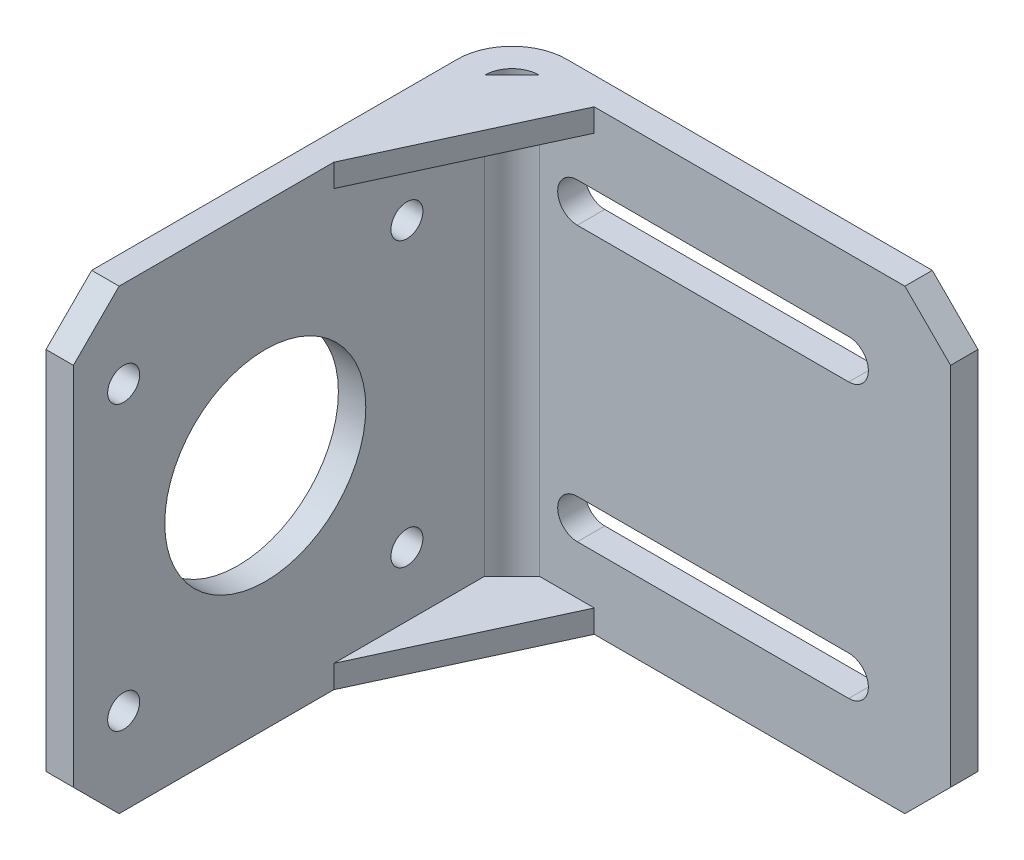
ISO-10303-21;
HEADER;
FILE_DESCRIPTION(('STEP AP214'),'2;1');
FILE_NAME('part.step','',(''),(''),'','','');
FILE_SCHEMA(('AUTOMOTIVE_DESIGN { 1 0 10303 214 1 1 1 1 }'));
ENDSEC;
DATA;
#1=APPLICATION_CONTEXT('core data for automotive mechanical design processes');
#2=APPLICATION_PROTOCOL_DEFINITION('international standard','automotive_design',2000,#1);
#3=PRODUCT_CONTEXT('',#1,'mechanical');
#4=PRODUCT('Part','Part','',(#3));
#5=PRODUCT_RELATED_PRODUCT_CATEGORY('part','',(#4));
#6=PRODUCT_DEFINITION_FORMATION('','',#4);
#7=PRODUCT_DEFINITION_CONTEXT('part definition',#1,'design');
#8=PRODUCT_DEFINITION('design','',#6,#7);
#9=PRODUCT_DEFINITION_SHAPE('','',#8);
#10=(LENGTH_UNIT() NAMED_UNIT(*) SI_UNIT(.MILLI.,.METRE.));
#11=(NAMED_UNIT(*) PLANE_ANGLE_UNIT() SI_UNIT($,.RADIAN.));
#12=(NAMED_UNIT(*) SI_UNIT($,.STERADIAN.) SOLID_ANGLE_UNIT());
#13=UNCERTAINTY_MEASURE_WITH_UNIT(LENGTH_MEASURE(1.E-05),#10,'distance_accuracy_value','');
#14=(GEOMETRIC_REPRESENTATION_CONTEXT(3) GLOBAL_UNCERTAINTY_ASSIGNED_CONTEXT((#13)) GLOBAL_UNIT_ASSIGNED_CONTEXT((#10,
#11,#12)) REPRESENTATION_CONTEXT('',''));
#15=CARTESIAN_POINT('',(0.,0.,0.));
#16=DIRECTION('',(0.,0.,1.));
#17=DIRECTION('',(1.,0.,0.));
#18=AXIS2_PLACEMENT_3D('',#15,#16,#17);
#19=CARTESIAN_POINT('',(0.,22.5,0.));
#20=DIRECTION('',(0.,1.,0.));
#21=DIRECTION('',(1.,0.,0.));
#22=AXIS2_PLACEMENT_3D('',#19,#20,#21);
#23=PLANE('',#22);
#24=DIRECTION('',(-0.419058177461747,0.,0.907959384500452));
#25=VECTOR('',#24,1.);
#26=CARTESIAN_POINT('',(12.,22.5,3.));
#27=LINE('',#26,#25);
#28=CARTESIAN_POINT('',(12.,22.5,3.));
#29=VERTEX_POINT('',#28);
#30=CARTESIAN_POINT('',(3.,22.5,22.5));
#31=VERTEX_POINT('',#30);
#32=EDGE_CURVE('E25',#29,#31,#27,.T.);
#33=ORIENTED_EDGE('',*,*,#32,.T.);
#34=DIRECTION('',(0.,0.,-1.));
#35=VECTOR('',#34,1.);
#36=CARTESIAN_POINT('',(3.,22.5,22.5));
#37=LINE('',#36,#35);
#38=CARTESIAN_POINT('',(3.,22.5,6.));
#39=VERTEX_POINT('',#38);
#40=EDGE_CURVE('E429',#31,#39,#37,.T.);
#41=ORIENTED_EDGE('',*,*,#40,.T.);
#42=DIRECTION('',(0.707106781186548,0.,-0.707106781186547));
#43=VECTOR('',#42,1.);
#44=CARTESIAN_POINT('',(3.,22.5,6.));
#45=LINE('',#44,#43);
#46=CARTESIAN_POINT('',(6.,22.5,3.));
#47=VERTEX_POINT('',#46);
#48=EDGE_CURVE('E10',#39,#47,#45,.T.);
#49=ORIENTED_EDGE('',*,*,#48,.T.);
#50=DIRECTION('',(1.,0.,0.));
#51=VECTOR('',#50,1.);
#52=CARTESIAN_POINT('',(6.,22.5,3.));
#53=LINE('',#52,#51);
#54=EDGE_CURVE('E335',#47,#29,#53,.T.);
#55=ORIENTED_EDGE('',*,*,#54,.T.);
#56=EDGE_LOOP('',(#33,#41,#49,#55));
#57=FACE_BOUND('',#56,.T.);
#58=ADVANCED_FACE('F16',(#57),#23,.F.);
#59=CARTESIAN_POINT('',(3.,22.5,6.));
#60=DIRECTION('',(0.707106781186547,0.,0.707106781186548));
#61=DIRECTION('',(0.,-1.,0.));
#62=AXIS2_PLACEMENT_3D('',#59,#60,#61);
#63=PLANE('',#62);
#64=DIRECTION('',(0.707106781186548,0.,-0.707106781186547));
#65=VECTOR('',#64,1.);
#66=CARTESIAN_POINT('',(3.,25.,6.));
#67=LINE('',#66,#65);
#68=CARTESIAN_POINT('',(3.,25.,6.));
#69=VERTEX_POINT('',#68);
#70=CARTESIAN_POINT('',(6.,25.,3.));
#71=VERTEX_POINT('',#70);
#72=EDGE_CURVE('E554',#69,#71,#67,.T.);
#73=ORIENTED_EDGE('',*,*,#72,.T.);
#74=DIRECTION('',(0.,-1.,0.));
#75=VECTOR('',#74,1.);
#76=CARTESIAN_POINT('',(6.,25.,3.));
#77=LINE('',#76,#75);
#78=EDGE_CURVE('E433',#71,#47,#77,.T.);
#79=ORIENTED_EDGE('',*,*,#78,.T.);
#80=ORIENTED_EDGE('',*,*,#48,.F.);
#81=DIRECTION('',(0.,-1.,0.));
#82=VECTOR('',#81,1.);
#83=CARTESIAN_POINT('',(3.,25.,6.));
#84=LINE('',#83,#82);
#85=EDGE_CURVE('E451',#69,#39,#84,.T.);
#86=ORIENTED_EDGE('',*,*,#85,.F.);
#87=EDGE_LOOP('',(#73,#79,#80,#86));
#88=FACE_BOUND('',#87,.T.);
#89=ADVANCED_FACE('F638',(#88),#63,.F.);
#90=CARTESIAN_POINT('',(12.,22.5,3.));
#91=DIRECTION('',(-0.907959384500452,0.,-0.419058177461747));
#92=DIRECTION('',(-0.419058177461747,0.,0.907959384500452));
#93=AXIS2_PLACEMENT_3D('',#90,#91,#92);
#94=PLANE('',#93);
#95=DIRECTION('',(-0.419058177461747,0.,0.907959384500452));
#96=VECTOR('',#95,1.);
#97=CARTESIAN_POINT('',(12.,25.,3.));
#98=LINE('',#97,#96);
#99=CARTESIAN_POINT('',(12.,25.,3.));
#100=VERTEX_POINT('',#99);
#101=CARTESIAN_POINT('',(3.,25.,22.5));
#102=VERTEX_POINT('',#101);
#103=EDGE_CURVE('E390',#100,#102,#98,.T.);
#104=ORIENTED_EDGE('',*,*,#103,.T.);
#105=DIRECTION('',(0.,1.,0.));
#106=VECTOR('',#105,1.);
#107=CARTESIAN_POINT('',(3.,22.5,22.5));
#108=LINE('',#107,#106);
#109=EDGE_CURVE('E438',#31,#102,#108,.T.);
#110=ORIENTED_EDGE('',*,*,#109,.F.);
#111=ORIENTED_EDGE('',*,*,#32,.F.);
#112=DIRECTION('',(0.,1.,0.));
#113=VECTOR('',#112,1.);
#114=CARTESIAN_POINT('',(12.,22.5,3.));
#115=LINE('',#114,#113);
#116=EDGE_CURVE('E365',#29,#100,#115,.T.);
#117=ORIENTED_EDGE('',*,*,#116,.T.);
#118=EDGE_LOOP('',(#104,#110,#111,#117));
#119=FACE_BOUND('',#118,.T.);
#120=ADVANCED_FACE('F643',(#119),#94,.F.);
#121=CARTESIAN_POINT('',(0.,-22.5,0.));
#122=DIRECTION('',(0.,-1.,0.));
#123=DIRECTION('',(0.,0.,-1.));
#124=AXIS2_PLACEMENT_3D('',#121,#122,#123);
#125=PLANE('',#124);
#126=DIRECTION('',(0.,0.,1.));
#127=VECTOR('',#126,1.);
#128=CARTESIAN_POINT('',(3.,-22.5,6.));
#129=LINE('',#128,#127);
#130=CARTESIAN_POINT('',(3.,-22.5,6.));
#131=VERTEX_POINT('',#130);
#132=CARTESIAN_POINT('',(3.,-22.5,22.5));
#133=VERTEX_POINT('',#132);
#134=EDGE_CURVE('E474',#131,#133,#129,.T.);
#135=ORIENTED_EDGE('',*,*,#134,.T.);
#136=DIRECTION('',(0.419058177461747,0.,-0.907959384500452));
#137=VECTOR('',#136,1.);
#138=CARTESIAN_POINT('',(3.,-22.5,22.5));
#139=LINE('',#138,#137);
#140=CARTESIAN_POINT('',(12.,-22.5,3.));
#141=VERTEX_POINT('',#140);
#142=EDGE_CURVE('E443',#133,#141,#139,.T.);
#143=ORIENTED_EDGE('',*,*,#142,.T.);
#144=DIRECTION('',(-1.,0.,0.));
#145=VECTOR('',#144,1.);
#146=CARTESIAN_POINT('',(12.,-22.5,3.));
#147=LINE('',#146,#145);
#148=CARTESIAN_POINT('',(6.,-22.5,3.));
#149=VERTEX_POINT('',#148);
#150=EDGE_CURVE('E334',#141,#149,#147,.T.);
#151=ORIENTED_EDGE('',*,*,#150,.T.);
#152=DIRECTION('',(-0.707106781186548,0.,0.707106781186547));
#153=VECTOR('',#152,1.);
#154=CARTESIAN_POINT('',(6.,-22.5,3.));
#155=LINE('',#154,#153);
#156=EDGE_CURVE('E19',#149,#131,#155,.T.);
#157=ORIENTED_EDGE('',*,*,#156,.T.);
#158=EDGE_LOOP('',(#135,#143,#151,#157));
#159=FACE_BOUND('',#158,.T.);
#160=ADVANCED_FACE('F713',(#159),#125,.F.);
#161=CARTESIAN_POINT('',(6.,-22.5,3.));
#162=DIRECTION('',(0.707106781186547,0.,0.707106781186548));
#163=DIRECTION('',(0.,-1.,0.));
#164=AXIS2_PLACEMENT_3D('',#161,#162,#163);
#165=PLANE('',#164);
#166=DIRECTION('',(-0.707106781186548,0.,0.707106781186547));
#167=VECTOR('',#166,1.);
#168=CARTESIAN_POINT('',(6.,-25.,3.));
#169=LINE('',#168,#167);
#170=CARTESIAN_POINT('',(6.,-25.,3.));
#171=VERTEX_POINT('',#170);
#172=CARTESIAN_POINT('',(3.,-25.,6.));
#173=VERTEX_POINT('',#172);
#174=EDGE_CURVE('E494',#171,#173,#169,.T.);
#175=ORIENTED_EDGE('',*,*,#174,.T.);
#176=DIRECTION('',(0.,-1.,0.));
#177=VECTOR('',#176,1.);
#178=CARTESIAN_POINT('',(3.,-22.5,6.));
#179=LINE('',#178,#177);
#180=EDGE_CURVE('E455',#131,#173,#179,.T.);
#181=ORIENTED_EDGE('',*,*,#180,.F.);
#182=ORIENTED_EDGE('',*,*,#156,.F.);
#183=DIRECTION('',(0.,-1.,0.));
#184=VECTOR('',#183,1.);
#185=CARTESIAN_POINT('',(6.,-22.5,3.));
#186=LINE('',#185,#184);
#187=EDGE_CURVE('E430',#149,#171,#186,.T.);
#188=ORIENTED_EDGE('',*,*,#187,.T.);
#189=EDGE_LOOP('',(#175,#181,#182,#188));
#190=FACE_BOUND('',#189,.T.);
#191=ADVANCED_FACE('F717',(#190),#165,.F.);
#192=CARTESIAN_POINT('',(3.,-22.5,22.5));
#193=DIRECTION('',(-0.907959384500452,0.,-0.419058177461747));
#194=DIRECTION('',(-0.419058177461747,0.,0.907959384500452));
#195=AXIS2_PLACEMENT_3D('',#192,#193,#194);
#196=PLANE('',#195);
#197=DIRECTION('',(0.419058177461747,0.,-0.907959384500452));
#198=VECTOR('',#197,1.);
#199=CARTESIAN_POINT('',(3.,-25.,22.5));
#200=LINE('',#199,#198);
#201=CARTESIAN_POINT('',(3.,-25.,22.5));
#202=VERTEX_POINT('',#201);
#203=CARTESIAN_POINT('',(12.,-25.,3.));
#204=VERTEX_POINT('',#203);
#205=EDGE_CURVE('E385',#202,#204,#200,.T.);
#206=ORIENTED_EDGE('',*,*,#205,.T.);
#207=DIRECTION('',(0.,-1.,0.));
#208=VECTOR('',#207,1.);
#209=CARTESIAN_POINT('',(12.,-22.5,3.));
#210=LINE('',#209,#208);
#211=EDGE_CURVE('E322',#141,#204,#210,.T.);
#212=ORIENTED_EDGE('',*,*,#211,.F.);
#213=ORIENTED_EDGE('',*,*,#142,.F.);
#214=DIRECTION('',(0.,-1.,0.));
#215=VECTOR('',#214,1.);
#216=CARTESIAN_POINT('',(3.,-22.5,22.5));
#217=LINE('',#216,#215);
#218=EDGE_CURVE('E418',#133,#202,#217,.T.);
#219=ORIENTED_EDGE('',*,*,#218,.T.);
#220=EDGE_LOOP('',(#206,#212,#213,#219));
#221=FACE_BOUND('',#220,.T.);
#222=ADVANCED_FACE('F635',(#221),#196,.F.);
#223=CARTESIAN_POINT('',(10.15,15.,-84.7610391916595));
#224=DIRECTION('',(0.,0.,1.));
#225=DIRECTION('',(1.,0.,0.));
#226=AXIS2_PLACEMENT_3D('',#223,#224,#225);
#227=CYLINDRICAL_SURFACE('',#226,2.15);
#228=DIRECTION('',(0.,0.,1.));
#229=VECTOR('',#228,1.);
#230=CARTESIAN_POINT('',(10.15,17.15,-84.7610391916595));
#231=LINE('',#230,#229);
#232=CARTESIAN_POINT('',(10.15,17.15,0.));
#233=VERTEX_POINT('',#232);
#234=CARTESIAN_POINT('',(10.15,17.15,3.));
#235=VERTEX_POINT('',#234);
#236=EDGE_CURVE('E446',#233,#235,#231,.T.);
#237=ORIENTED_EDGE('',*,*,#236,.T.);
#238=CARTESIAN_POINT('',(10.15,15.,3.));
#239=DIRECTION('',(0.,0.,-1.));
#240=DIRECTION('',(0.,-1.,0.));
#241=AXIS2_PLACEMENT_3D('',#238,#239,#240);
#242=CIRCLE('',#241,2.15);
#243=CARTESIAN_POINT('',(10.15,12.85,3.));
#244=VERTEX_POINT('',#243);
#245=EDGE_CURVE('E345',#244,#235,#242,.T.);
#246=ORIENTED_EDGE('',*,*,#245,.F.);
#247=DIRECTION('',(0.,0.,1.));
#248=VECTOR('',#247,1.);
#249=CARTESIAN_POINT('',(10.15,12.85,-84.7610391916595));
#250=LINE('',#249,#248);
#251=CARTESIAN_POINT('',(10.15,12.85,0.));
#252=VERTEX_POINT('',#251);
#253=EDGE_CURVE('E485',#252,#244,#250,.T.);
#254=ORIENTED_EDGE('',*,*,#253,.F.);
#255=CARTESIAN_POINT('',(10.15,15.,0.));
#256=DIRECTION('',(0.,0.,1.));
#257=DIRECTION('',(-1.,0.,0.));
#258=AXIS2_PLACEMENT_3D('',#255,#256,#257);
#259=CIRCLE('',#258,2.15);
#260=EDGE_CURVE('E386',#233,#252,#259,.T.);
#261=ORIENTED_EDGE('',*,*,#260,.F.);
#262=EDGE_LOOP('',(#237,#246,#254,#261));
#263=FACE_BOUND('',#262,.T.);
#264=ADVANCED_FACE('F614',(#263),#227,.F.);
#265=CARTESIAN_POINT('',(10.15,17.15,-84.7610391916595));
#266=DIRECTION('',(0.,-1.,0.));
#267=DIRECTION('',(-1.,0.,0.));
#268=AXIS2_PLACEMENT_3D('',#265,#266,#267);
#269=PLANE('',#268);
#270=DIRECTION('',(0.,0.,1.));
#271=VECTOR('',#270,1.);
#272=CARTESIAN_POINT('',(39.85,17.15,-84.7610391916595));
#273=LINE('',#272,#271);
#274=CARTESIAN_POINT('',(39.85,17.15,0.));
#275=VERTEX_POINT('',#274);
#276=CARTESIAN_POINT('',(39.85,17.15,3.));
#277=VERTEX_POINT('',#276);
#278=EDGE_CURVE('E484',#275,#277,#273,.T.);
#279=ORIENTED_EDGE('',*,*,#278,.T.);
#280=DIRECTION('',(1.,0.,0.));
#281=VECTOR('',#280,1.);
#282=CARTESIAN_POINT('',(10.15,17.15,3.));
#283=LINE('',#282,#281);
#284=EDGE_CURVE('E361',#235,#277,#283,.T.);
#285=ORIENTED_EDGE('',*,*,#284,.F.);
#286=ORIENTED_EDGE('',*,*,#236,.F.);
#287=DIRECTION('',(-1.,0.,0.));
#288=VECTOR('',#287,1.);
#289=CARTESIAN_POINT('',(0.,17.15,0.));
#290=LINE('',#289,#288);
#291=EDGE_CURVE('E391',#275,#233,#290,.T.);
#292=ORIENTED_EDGE('',*,*,#291,.F.);
#293=EDGE_LOOP('',(#279,#285,#286,#292));
#294=FACE_BOUND('',#293,.T.);
#295=ADVANCED_FACE('F626',(#294),#269,.T.);
#296=CARTESIAN_POINT('',(39.85,15.,-84.7610391916595));
#297=DIRECTION('',(0.,0.,1.));
#298=DIRECTION('',(1.,0.,0.));
#299=AXIS2_PLACEMENT_3D('',#296,#297,#298);
#300=CYLINDRICAL_SURFACE('',#299,2.15);
#301=DIRECTION('',(0.,0.,1.));
#302=VECTOR('',#301,1.);
#303=CARTESIAN_POINT('',(39.85,12.85,-84.7610391916595));
#304=LINE('',#303,#302);
#305=CARTESIAN_POINT('',(39.85,12.85,0.));
#306=VERTEX_POINT('',#305);
#307=CARTESIAN_POINT('',(39.85,12.85,3.));
#308=VERTEX_POINT('',#307);
#309=EDGE_CURVE('E481',#306,#308,#304,.T.);
#310=ORIENTED_EDGE('',*,*,#309,.T.);
#311=CARTESIAN_POINT('',(39.85,15.,3.));
#312=DIRECTION('',(0.,0.,-1.));
#313=DIRECTION('',(0.,1.,0.));
#314=AXIS2_PLACEMENT_3D('',#311,#312,#313);
#315=CIRCLE('',#314,2.15);
#316=EDGE_CURVE('E309',#277,#308,#315,.T.);
#317=ORIENTED_EDGE('',*,*,#316,.F.);
#318=ORIENTED_EDGE('',*,*,#278,.F.);
#319=CARTESIAN_POINT('',(39.85,15.,0.));
#320=DIRECTION('',(0.,0.,1.));
#321=DIRECTION('',(-1.,0.,0.));
#322=AXIS2_PLACEMENT_3D('',#319,#320,#321);
#323=CIRCLE('',#322,2.15);
#324=EDGE_CURVE('E524',#306,#275,#323,.T.);
#325=ORIENTED_EDGE('',*,*,#324,.F.);
#326=EDGE_LOOP('',(#310,#317,#318,#325));
#327=FACE_BOUND('',#326,.T.);
#328=ADVANCED_FACE('F619',(#327),#300,.F.);
#329=CARTESIAN_POINT('',(10.15,12.85,-84.7610391916595));
#330=DIRECTION('',(0.,-1.,0.));
#331=DIRECTION('',(-1.,0.,0.));
#332=AXIS2_PLACEMENT_3D('',#329,#330,#331);
#333=PLANE('',#332);
#334=DIRECTION('',(-1.,0.,0.));
#335=VECTOR('',#334,1.);
#336=CARTESIAN_POINT('',(0.,12.85,0.));
#337=LINE('',#336,#335);
#338=EDGE_CURVE('E516',#306,#252,#337,.T.);
#339=ORIENTED_EDGE('',*,*,#338,.T.);
#340=ORIENTED_EDGE('',*,*,#253,.T.);
#341=DIRECTION('',(1.,0.,0.));
#342=VECTOR('',#341,1.);
#343=CARTESIAN_POINT('',(10.15,12.85,3.));
#344=LINE('',#343,#342);
#345=EDGE_CURVE('E328',#244,#308,#344,.T.);
#346=ORIENTED_EDGE('',*,*,#345,.T.);
#347=ORIENTED_EDGE('',*,*,#309,.F.);
#348=EDGE_LOOP('',(#339,#340,#346,#347));
#349=FACE_BOUND('',#348,.T.);
#350=ADVANCED_FACE('F609',(#349),#333,.F.);
#351=CARTESIAN_POINT('',(10.15,-15.,-84.7610391916595));
#352=DIRECTION('',(0.,0.,1.));
#353=DIRECTION('',(1.,0.,0.));
#354=AXIS2_PLACEMENT_3D('',#351,#352,#353);
#355=CYLINDRICAL_SURFACE('',#354,2.15);
#356=DIRECTION('',(0.,0.,1.));
#357=VECTOR('',#356,1.);
#358=CARTESIAN_POINT('',(10.15,-12.85,-84.7610391916595));
#359=LINE('',#358,#357);
#360=CARTESIAN_POINT('',(10.15,-12.85,0.));
#361=VERTEX_POINT('',#360);
#362=CARTESIAN_POINT('',(10.15,-12.85,3.));
#363=VERTEX_POINT('',#362);
#364=EDGE_CURVE('E298',#361,#363,#359,.T.);
#365=ORIENTED_EDGE('',*,*,#364,.T.);
#366=CARTESIAN_POINT('',(10.15,-15.,3.));
#367=DIRECTION('',(0.,0.,-1.));
#368=DIRECTION('',(0.,-1.,0.));
#369=AXIS2_PLACEMENT_3D('',#366,#367,#368);
#370=CIRCLE('',#369,2.15);
#371=CARTESIAN_POINT('',(10.15,-17.15,3.));
#372=VERTEX_POINT('',#371);
#373=EDGE_CURVE('E307',#372,#363,#370,.T.);
#374=ORIENTED_EDGE('',*,*,#373,.F.);
#375=DIRECTION('',(0.,0.,1.));
#376=VECTOR('',#375,1.);
#377=CARTESIAN_POINT('',(10.15,-17.15,-84.7610391916595));
#378=LINE('',#377,#376);
#379=CARTESIAN_POINT('',(10.15,-17.15,0.));
#380=VERTEX_POINT('',#379);
#381=EDGE_CURVE('E503',#380,#372,#378,.T.);
#382=ORIENTED_EDGE('',*,*,#381,.F.);
#383=CARTESIAN_POINT('',(10.15,-15.,0.));
#384=DIRECTION('',(0.,0.,1.));
#385=DIRECTION('',(-1.,0.,0.));
#386=AXIS2_PLACEMENT_3D('',#383,#384,#385);
#387=CIRCLE('',#386,2.15);
#388=EDGE_CURVE('E463',#361,#380,#387,.T.);
#389=ORIENTED_EDGE('',*,*,#388,.F.);
#390=EDGE_LOOP('',(#365,#374,#382,#389));
#391=FACE_BOUND('',#390,.T.);
#392=ADVANCED_FACE('F1204',(#391),#355,.F.);
#393=CARTESIAN_POINT('',(10.15,-12.85,-84.7610391916595));
#394=DIRECTION('',(0.,-1.,0.));
#395=DIRECTION('',(0.,0.,-1.));
#396=AXIS2_PLACEMENT_3D('',#393,#394,#395);
#397=PLANE('',#396);
#398=DIRECTION('',(0.,0.,1.));
#399=VECTOR('',#398,1.);
#400=CARTESIAN_POINT('',(39.85,-12.85,-84.7610391916595));
#401=LINE('',#400,#399);
#402=CARTESIAN_POINT('',(39.85,-12.85,0.));
#403=VERTEX_POINT('',#402);
#404=CARTESIAN_POINT('',(39.85,-12.85,3.));
#405=VERTEX_POINT('',#404);
#406=EDGE_CURVE('E286',#403,#405,#401,.T.);
#407=ORIENTED_EDGE('',*,*,#406,.T.);
#408=DIRECTION('',(1.,0.,0.));
#409=VECTOR('',#408,1.);
#410=CARTESIAN_POINT('',(10.15,-12.85,3.));
#411=LINE('',#410,#409);
#412=EDGE_CURVE('E289',#363,#405,#411,.T.);
#413=ORIENTED_EDGE('',*,*,#412,.F.);
#414=ORIENTED_EDGE('',*,*,#364,.F.);
#415=DIRECTION('',(-1.,0.,0.));
#416=VECTOR('',#415,1.);
#417=CARTESIAN_POINT('',(0.,-12.85,0.));
#418=LINE('',#417,#416);
#419=EDGE_CURVE('E292',#403,#361,#418,.T.);
#420=ORIENTED_EDGE('',*,*,#419,.F.);
#421=EDGE_LOOP('',(#407,#413,#414,#420));
#422=FACE_BOUND('',#421,.T.);
#423=ADVANCED_FACE('F288',(#422),#397,.T.);
#424=CARTESIAN_POINT('',(39.85,-15.,-84.7610391916595));
#425=DIRECTION('',(0.,0.,1.));
#426=DIRECTION('',(1.,0.,0.));
#427=AXIS2_PLACEMENT_3D('',#424,#425,#426);
#428=CYLINDRICAL_SURFACE('',#427,2.15);
#429=DIRECTION('',(0.,0.,1.));
#430=VECTOR('',#429,1.);
#431=CARTESIAN_POINT('',(39.85,-17.15,-84.7610391916595));
#432=LINE('',#431,#430);
#433=CARTESIAN_POINT('',(39.85,-17.15,0.));
#434=VERTEX_POINT('',#433);
#435=CARTESIAN_POINT('',(39.85,-17.15,3.));
#436=VERTEX_POINT('',#435);
#437=EDGE_CURVE('E299',#434,#436,#432,.T.);
#438=ORIENTED_EDGE('',*,*,#437,.T.);
#439=CARTESIAN_POINT('',(39.85,-15.,3.));
#440=DIRECTION('',(0.,0.,-1.));
#441=DIRECTION('',(0.,1.,0.));
#442=AXIS2_PLACEMENT_3D('',#439,#440,#441);
#443=CIRCLE('',#442,2.15);
#444=EDGE_CURVE('E305',#405,#436,#443,.T.);
#445=ORIENTED_EDGE('',*,*,#444,.F.);
#446=ORIENTED_EDGE('',*,*,#406,.F.);
#447=CARTESIAN_POINT('',(39.85,-15.,0.));
#448=DIRECTION('',(0.,0.,1.));
#449=DIRECTION('',(-1.,0.,0.));
#450=AXIS2_PLACEMENT_3D('',#447,#448,#449);
#451=CIRCLE('',#450,2.15);
#452=EDGE_CURVE('E412',#434,#403,#451,.T.);
#453=ORIENTED_EDGE('',*,*,#452,.F.);
#454=EDGE_LOOP('',(#438,#445,#446,#453));
#455=FACE_BOUND('',#454,.T.);
#456=ADVANCED_FACE('F311',(#455),#428,.F.);
#457=CARTESIAN_POINT('',(10.15,-17.15,-84.7610391916595));
#458=DIRECTION('',(0.,-1.,0.));
#459=DIRECTION('',(0.,0.,-1.));
#460=AXIS2_PLACEMENT_3D('',#457,#458,#459);
#461=PLANE('',#460);
#462=DIRECTION('',(-1.,0.,0.));
#463=VECTOR('',#462,1.);
#464=CARTESIAN_POINT('',(0.,-17.15,0.));
#465=LINE('',#464,#463);
#466=EDGE_CURVE('E408',#434,#380,#465,.T.);
#467=ORIENTED_EDGE('',*,*,#466,.T.);
#468=ORIENTED_EDGE('',*,*,#381,.T.);
#469=DIRECTION('',(1.,0.,0.));
#470=VECTOR('',#469,1.);
#471=CARTESIAN_POINT('',(10.15,-17.15,3.));
#472=LINE('',#471,#470);
#473=EDGE_CURVE('E314',#372,#436,#472,.T.);
#474=ORIENTED_EDGE('',*,*,#473,.T.);
#475=ORIENTED_EDGE('',*,*,#437,.F.);
#476=EDGE_LOOP('',(#467,#468,#474,#475));
#477=FACE_BOUND('',#476,.T.);
#478=ADVANCED_FACE('F1157',(#477),#461,.F.);
#479=CARTESIAN_POINT('',(0.,20.,51.));
#480=DIRECTION('',(0.,0.707106781186548,0.707106781186547));
#481=DIRECTION('',(1.,0.,0.));
#482=AXIS2_PLACEMENT_3D('',#479,#480,#481);
#483=PLANE('',#482);
#484=DIRECTION('',(0.,-0.707106781186547,0.707106781186548));
#485=VECTOR('',#484,1.);
#486=CARTESIAN_POINT('',(3.,20.,51.));
#487=LINE('',#486,#485);
#488=CARTESIAN_POINT('',(3.,25.,46.));
#489=VERTEX_POINT('',#488);
#490=CARTESIAN_POINT('',(3.,20.,51.));
#491=VERTEX_POINT('',#490);
#492=EDGE_CURVE('E450',#489,#491,#487,.T.);
#493=ORIENTED_EDGE('',*,*,#492,.F.);
#494=DIRECTION('',(1.,0.,0.));
#495=VECTOR('',#494,1.);
#496=CARTESIAN_POINT('',(0.,25.,46.));
#497=LINE('',#496,#495);
#498=CARTESIAN_POINT('',(0.,25.,46.));
#499=VERTEX_POINT('',#498);
#500=EDGE_CURVE('E547',#499,#489,#497,.T.);
#501=ORIENTED_EDGE('',*,*,#500,.F.);
#502=DIRECTION('',(0.,0.707106781186547,-0.707106781186548));
#503=VECTOR('',#502,1.);
#504=CARTESIAN_POINT('',(0.,48.,23.));
#505=LINE('',#504,#503);
#506=CARTESIAN_POINT('',(0.,20.,51.));
#507=VERTEX_POINT('',#506);
#508=EDGE_CURVE('E528',#507,#499,#505,.T.);
#509=ORIENTED_EDGE('',*,*,#508,.F.);
#510=DIRECTION('',(-1.,0.,0.));
#511=VECTOR('',#510,1.);
#512=CARTESIAN_POINT('',(0.,20.,51.));
#513=LINE('',#512,#511);
#514=EDGE_CURVE('E346',#491,#507,#513,.T.);
#515=ORIENTED_EDGE('',*,*,#514,.F.);
#516=EDGE_LOOP('',(#493,#501,#509,#515));
#517=FACE_BOUND('',#516,.T.);
#518=ADVANCED_FACE('F695',(#517),#483,.T.);
#519=CARTESIAN_POINT('',(0.,-25.,46.));
#520=DIRECTION('',(0.,0.707106781186548,-0.707106781186548));
#521=DIRECTION('',(-1.,0.,0.));
#522=AXIS2_PLACEMENT_3D('',#519,#520,#521);
#523=PLANE('',#522);
#524=DIRECTION('',(0.,-0.707106781186548,-0.707106781186548));
#525=VECTOR('',#524,1.);
#526=CARTESIAN_POINT('',(3.,-25.,46.));
#527=LINE('',#526,#525);
#528=CARTESIAN_POINT('',(3.,-20.,51.));
#529=VERTEX_POINT('',#528);
#530=CARTESIAN_POINT('',(3.,-25.,46.));
#531=VERTEX_POINT('',#530);
#532=EDGE_CURVE('E419',#529,#531,#527,.T.);
#533=ORIENTED_EDGE('',*,*,#532,.F.);
#534=DIRECTION('',(1.,0.,0.));
#535=VECTOR('',#534,1.);
#536=CARTESIAN_POINT('',(0.,-20.,51.));
#537=LINE('',#536,#535);
#538=CARTESIAN_POINT('',(0.,-20.,51.));
#539=VERTEX_POINT('',#538);
#540=EDGE_CURVE('E351',#539,#529,#537,.T.);
#541=ORIENTED_EDGE('',*,*,#540,.F.);
#542=DIRECTION('',(0.,0.707106781186548,0.707106781186548));
#543=VECTOR('',#542,1.);
#544=CARTESIAN_POINT('',(0.,-23.,48.));
#545=LINE('',#544,#543);
#546=CARTESIAN_POINT('',(0.,-25.,46.));
#547=VERTEX_POINT('',#546);
#548=EDGE_CURVE('E531',#547,#539,#545,.T.);
#549=ORIENTED_EDGE('',*,*,#548,.F.);
#550=DIRECTION('',(-1.,0.,0.));
#551=VECTOR('',#550,1.);
#552=CARTESIAN_POINT('',(0.,-25.,46.));
#553=LINE('',#552,#551);
#554=EDGE_CURVE('E380',#531,#547,#553,.T.);
#555=ORIENTED_EDGE('',*,*,#554,.F.);
#556=EDGE_LOOP('',(#533,#541,#549,#555));
#557=FACE_BOUND('',#556,.T.);
#558=ADVANCED_FACE('F703',(#557),#523,.F.);
#559=CARTESIAN_POINT('',(51.,-20.,0.));
#560=DIRECTION('',(0.707106781186548,-0.707106781186548,0.));
#561=DIRECTION('',(0.,0.,-1.));
#562=AXIS2_PLACEMENT_3D('',#559,#560,#561);
#563=PLANE('',#562);
#564=DIRECTION('',(0.707106781186548,0.707106781186548,0.));
#565=VECTOR('',#564,1.);
#566=CARTESIAN_POINT('',(51.,-20.,3.));
#567=LINE('',#566,#565);
#568=CARTESIAN_POINT('',(46.,-25.,3.));
#569=VERTEX_POINT('',#568);
#570=CARTESIAN_POINT('',(51.,-20.,3.));
#571=VERTEX_POINT('',#570);
#572=EDGE_CURVE('E341',#569,#571,#567,.T.);
#573=ORIENTED_EDGE('',*,*,#572,.F.);
#574=DIRECTION('',(0.,0.,1.));
#575=VECTOR('',#574,1.);
#576=CARTESIAN_POINT('',(46.,-25.,0.));
#577=LINE('',#576,#575);
#578=CARTESIAN_POINT('',(46.,-25.,0.));
#579=VERTEX_POINT('',#578);
#580=EDGE_CURVE('E499',#579,#569,#577,.T.);
#581=ORIENTED_EDGE('',*,*,#580,.F.);
#582=DIRECTION('',(-0.707106781186548,-0.707106781186548,0.));
#583=VECTOR('',#582,1.);
#584=CARTESIAN_POINT('',(48.,-23.,0.));
#585=LINE('',#584,#583);
#586=CARTESIAN_POINT('',(51.,-20.,0.));
#587=VERTEX_POINT('',#586);
#588=EDGE_CURVE('E352',#587,#579,#585,.T.);
#589=ORIENTED_EDGE('',*,*,#588,.F.);
#590=DIRECTION('',(0.,0.,-1.));
#591=VECTOR('',#590,1.);
#592=CARTESIAN_POINT('',(51.,-20.,0.));
#593=LINE('',#592,#591);
#594=EDGE_CURVE('E563',#571,#587,#593,.T.);
#595=ORIENTED_EDGE('',*,*,#594,.F.);
#596=EDGE_LOOP('',(#573,#581,#589,#595));
#597=FACE_BOUND('',#596,.T.);
#598=ADVANCED_FACE('F1146',(#597),#563,.T.);
#599=CARTESIAN_POINT('',(46.,25.,0.));
#600=DIRECTION('',(-0.707106781186547,-0.707106781186548,0.));
#601=DIRECTION('',(-0.707106781186548,0.707106781186547,0.));
#602=AXIS2_PLACEMENT_3D('',#599,#600,#601);
#603=PLANE('',#602);
#604=DIRECTION('',(-0.707106781186548,0.707106781186547,0.));
#605=VECTOR('',#604,1.);
#606=CARTESIAN_POINT('',(46.,25.,3.));
#607=LINE('',#606,#605);
#608=CARTESIAN_POINT('',(51.,20.,3.));
#609=VERTEX_POINT('',#608);
#610=CARTESIAN_POINT('',(46.,25.,3.));
#611=VERTEX_POINT('',#610);
#612=EDGE_CURVE('E399',#609,#611,#607,.T.);
#613=ORIENTED_EDGE('',*,*,#612,.F.);
#614=DIRECTION('',(0.,0.,1.));
#615=VECTOR('',#614,1.);
#616=CARTESIAN_POINT('',(51.,20.,0.));
#617=LINE('',#616,#615);
#618=CARTESIAN_POINT('',(51.,20.,0.));
#619=VERTEX_POINT('',#618);
#620=EDGE_CURVE('E560',#619,#609,#617,.T.);
#621=ORIENTED_EDGE('',*,*,#620,.F.);
#622=DIRECTION('',(0.707106781186548,-0.707106781186547,0.));
#623=VECTOR('',#622,1.);
#624=CARTESIAN_POINT('',(23.,48.,0.));
#625=LINE('',#624,#623);
#626=CARTESIAN_POINT('',(46.,25.,0.));
#627=VERTEX_POINT('',#626);
#628=EDGE_CURVE('E493',#627,#619,#625,.T.);
#629=ORIENTED_EDGE('',*,*,#628,.F.);
#630=DIRECTION('',(0.,0.,-1.));
#631=VECTOR('',#630,1.);
#632=CARTESIAN_POINT('',(46.,25.,0.));
#633=LINE('',#632,#631);
#634=EDGE_CURVE('E537',#611,#627,#633,.T.);
#635=ORIENTED_EDGE('',*,*,#634,.F.);
#636=EDGE_LOOP('',(#613,#621,#629,#635));
#637=FACE_BOUND('',#636,.T.);
#638=ADVANCED_FACE('F675',(#637),#603,.F.);
#639=CARTESIAN_POINT('',(87.7610391916595,15.5,14.5));
#640=DIRECTION('',(-1.,0.,0.));
#641=DIRECTION('',(0.,0.,1.));
#642=AXIS2_PLACEMENT_3D('',#639,#640,#641);
#643=CYLINDRICAL_SURFACE('',#642,1.75);
#644=CARTESIAN_POINT('',(0.,15.5,14.5));
#645=DIRECTION('',(-1.,0.,0.));
#646=DIRECTION('',(0.,-1.,0.));
#647=AXIS2_PLACEMENT_3D('',#644,#645,#646);
#648=CIRCLE('',#647,1.75);
#649=CARTESIAN_POINT('',(0.,13.75,14.5));
#650=VERTEX_POINT('',#649);
#651=EDGE_CURVE('E350',#650,#650,#648,.T.);
#652=ORIENTED_EDGE('',*,*,#651,.T.);
#653=EDGE_LOOP('',(#652));
#654=FACE_BOUND('',#653,.T.);
#655=CARTESIAN_POINT('',(3.,15.5,14.5));
#656=DIRECTION('',(-1.,0.,0.));
#657=DIRECTION('',(0.,0.,1.));
#658=AXIS2_PLACEMENT_3D('',#655,#656,#657);
#659=CIRCLE('',#658,1.75);
#660=CARTESIAN_POINT('',(3.,15.5,16.25));
#661=VERTEX_POINT('',#660);
#662=EDGE_CURVE('E407',#661,#661,#659,.T.);
#663=ORIENTED_EDGE('',*,*,#662,.F.);
#664=EDGE_LOOP('',(#663));
#665=FACE_BOUND('',#664,.T.);
#666=ADVANCED_FACE('F1116',(#654,#665),#643,.F.);
#667=CARTESIAN_POINT('',(87.7610391916595,-15.5,14.5));
#668=DIRECTION('',(-1.,0.,0.));
#669=DIRECTION('',(0.,0.,1.));
#670=AXIS2_PLACEMENT_3D('',#667,#668,#669);
#671=CYLINDRICAL_SURFACE('',#670,1.75);
#672=CARTESIAN_POINT('',(0.,-15.5,14.5));
#673=DIRECTION('',(-1.,0.,0.));
#674=DIRECTION('',(0.,-1.,0.));
#675=AXIS2_PLACEMENT_3D('',#672,#673,#674);
#676=CIRCLE('',#675,1.75);
#677=CARTESIAN_POINT('',(0.,-17.25,14.5));
#678=VERTEX_POINT('',#677);
#679=EDGE_CURVE('E520',#678,#678,#676,.T.);
#680=ORIENTED_EDGE('',*,*,#679,.T.);
#681=EDGE_LOOP('',(#680));
#682=FACE_BOUND('',#681,.T.);
#683=CARTESIAN_POINT('',(3.,-15.5,14.5));
#684=DIRECTION('',(-1.,0.,0.));
#685=DIRECTION('',(0.,0.,1.));
#686=AXIS2_PLACEMENT_3D('',#683,#684,#685);
#687=CIRCLE('',#686,1.75);
#688=CARTESIAN_POINT('',(3.,-15.5,16.25));
#689=VERTEX_POINT('',#688);
#690=EDGE_CURVE('E422',#689,#689,#687,.T.);
#691=ORIENTED_EDGE('',*,*,#690,.F.);
#692=EDGE_LOOP('',(#691));
#693=FACE_BOUND('',#692,.T.);
#694=ADVANCED_FACE('F1111',(#682,#693),#671,.F.);
#695=CARTESIAN_POINT('',(87.7610391916595,-15.5,45.5));
#696=DIRECTION('',(-1.,0.,0.));
#697=DIRECTION('',(0.,0.,1.));
#698=AXIS2_PLACEMENT_3D('',#695,#696,#697);
#699=CYLINDRICAL_SURFACE('',#698,1.75);
#700=CARTESIAN_POINT('',(0.,-15.5,45.5));
#701=DIRECTION('',(-1.,0.,0.));
#702=DIRECTION('',(0.,-1.,0.));
#703=AXIS2_PLACEMENT_3D('',#700,#701,#702);
#704=CIRCLE('',#703,1.75);
#705=CARTESIAN_POINT('',(0.,-17.25,45.5));
#706=VERTEX_POINT('',#705);
#707=EDGE_CURVE('E517',#706,#706,#704,.T.);
#708=ORIENTED_EDGE('',*,*,#707,.T.);
#709=EDGE_LOOP('',(#708));
#710=FACE_BOUND('',#709,.T.);
#711=CARTESIAN_POINT('',(3.,-15.5,45.5));
#712=DIRECTION('',(-1.,0.,0.));
#713=DIRECTION('',(0.,0.,1.));
#714=AXIS2_PLACEMENT_3D('',#711,#712,#713);
#715=CIRCLE('',#714,1.75);
#716=CARTESIAN_POINT('',(3.,-15.5,47.25));
#717=VERTEX_POINT('',#716);
#718=EDGE_CURVE('E373',#717,#717,#715,.T.);
#719=ORIENTED_EDGE('',*,*,#718,.F.);
#720=EDGE_LOOP('',(#719));
#721=FACE_BOUND('',#720,.T.);
#722=ADVANCED_FACE('F1018',(#710,#721),#699,.F.);
#723=CARTESIAN_POINT('',(87.7610391916595,15.5,45.5));
#724=DIRECTION('',(-1.,0.,0.));
#725=DIRECTION('',(0.,0.,1.));
#726=AXIS2_PLACEMENT_3D('',#723,#724,#725);
#727=CYLINDRICAL_SURFACE('',#726,1.75);
#728=CARTESIAN_POINT('',(0.,15.5,45.5));
#729=DIRECTION('',(-1.,0.,0.));
#730=DIRECTION('',(0.,-1.,0.));
#731=AXIS2_PLACEMENT_3D('',#728,#729,#730);
#732=CIRCLE('',#731,1.75);
#733=CARTESIAN_POINT('',(0.,13.75,45.5));
#734=VERTEX_POINT('',#733);
#735=EDGE_CURVE('E43',#734,#734,#732,.T.);
#736=ORIENTED_EDGE('',*,*,#735,.T.);
#737=EDGE_LOOP('',(#736));
#738=FACE_BOUND('',#737,.T.);
#739=CARTESIAN_POINT('',(3.,15.5,45.5));
#740=DIRECTION('',(-1.,0.,0.));
#741=DIRECTION('',(0.,0.,1.));
#742=AXIS2_PLACEMENT_3D('',#739,#740,#741);
#743=CIRCLE('',#742,1.75);
#744=CARTESIAN_POINT('',(3.,15.5,47.25));
#745=VERTEX_POINT('',#744);
#746=EDGE_CURVE('E369',#745,#745,#743,.T.);
#747=ORIENTED_EDGE('',*,*,#746,.F.);
#748=EDGE_LOOP('',(#747));
#749=FACE_BOUND('',#748,.T.);
#750=ADVANCED_FACE('F1013',(#738,#749),#727,.F.);
#751=CARTESIAN_POINT('',(87.7610391916595,0.,30.));
#752=DIRECTION('',(-1.,0.,0.));
#753=DIRECTION('',(0.,0.,1.));
#754=AXIS2_PLACEMENT_3D('',#751,#752,#753);
#755=CYLINDRICAL_SURFACE('',#754,11.);
#756=CARTESIAN_POINT('',(0.,0.,30.));
#757=DIRECTION('',(-1.,0.,0.));
#758=DIRECTION('',(0.,-1.,0.));
#759=AXIS2_PLACEMENT_3D('',#756,#757,#758);
#760=CIRCLE('',#759,11.);
#761=CARTESIAN_POINT('',(0.,-11.,30.));
#762=VERTEX_POINT('',#761);
#763=EDGE_CURVE('E36',#762,#762,#760,.T.);
#764=ORIENTED_EDGE('',*,*,#763,.T.);
#765=EDGE_LOOP('',(#764));
#766=FACE_BOUND('',#765,.T.);
#767=CARTESIAN_POINT('',(3.,0.,30.));
#768=DIRECTION('',(-1.,0.,0.));
#769=DIRECTION('',(0.,0.,1.));
#770=AXIS2_PLACEMENT_3D('',#767,#768,#769);
#771=CIRCLE('',#770,11.);
#772=CARTESIAN_POINT('',(3.,0.,41.));
#773=VERTEX_POINT('',#772);
#774=EDGE_CURVE('E372',#773,#773,#771,.T.);
#775=ORIENTED_EDGE('',*,*,#774,.F.);
#776=EDGE_LOOP('',(#775));
#777=FACE_BOUND('',#776,.T.);
#778=ADVANCED_FACE('F985',(#766,#777),#755,.F.);
#779=CARTESIAN_POINT('',(6.,25.,6.));
#780=DIRECTION('',(0.,-1.,0.));
#781=DIRECTION('',(0.,0.,-1.));
#782=AXIS2_PLACEMENT_3D('',#779,#780,#781);
#783=CYLINDRICAL_SURFACE('',#782,3.);
#784=CARTESIAN_POINT('',(6.,-25.,6.));
#785=DIRECTION('',(0.,-1.,0.));
#786=DIRECTION('',(0.,0.,-1.));
#787=AXIS2_PLACEMENT_3D('',#784,#785,#786);
#788=CIRCLE('',#787,3.);
#789=EDGE_CURVE('E498',#173,#171,#788,.T.);
#790=ORIENTED_EDGE('',*,*,#789,.T.);
#791=ORIENTED_EDGE('',*,*,#187,.F.);
#792=DIRECTION('',(0.,-1.,0.));
#793=VECTOR('',#792,1.);
#794=CARTESIAN_POINT('',(6.,25.,3.));
#795=LINE('',#794,#793);
#796=EDGE_CURVE('E331',#47,#149,#795,.T.);
#797=ORIENTED_EDGE('',*,*,#796,.F.);
#798=ORIENTED_EDGE('',*,*,#78,.F.);
#799=CARTESIAN_POINT('',(6.,25.,6.));
#800=DIRECTION('',(0.,-1.,0.));
#801=DIRECTION('',(0.,0.,-1.));
#802=AXIS2_PLACEMENT_3D('',#799,#800,#801);
#803=CIRCLE('',#802,3.);
#804=EDGE_CURVE('E550',#69,#71,#803,.T.);
#805=ORIENTED_EDGE('',*,*,#804,.F.);
#806=ORIENTED_EDGE('',*,*,#85,.T.);
#807=DIRECTION('',(0.,-1.,0.));
#808=VECTOR('',#807,1.);
#809=CARTESIAN_POINT('',(3.,25.,6.));
#810=LINE('',#809,#808);
#811=EDGE_CURVE('E413',#39,#131,#810,.T.);
#812=ORIENTED_EDGE('',*,*,#811,.T.);
#813=ORIENTED_EDGE('',*,*,#180,.T.);
#814=EDGE_LOOP('',(#790,#791,#797,#798,#805,#806,#812,#813));
#815=FACE_BOUND('',#814,.T.);
#816=ADVANCED_FACE('F659',(#815),#783,.F.);
#817=CARTESIAN_POINT('',(6.,25.,6.));
#818=DIRECTION('',(0.,-1.,0.));
#819=DIRECTION('',(0.,0.,-1.));
#820=AXIS2_PLACEMENT_3D('',#817,#818,#819);
#821=CYLINDRICAL_SURFACE('',#820,6.);
#822=CARTESIAN_POINT('',(6.,-25.,6.));
#823=DIRECTION('',(0.,-1.,0.));
#824=DIRECTION('',(0.,0.,1.));
#825=AXIS2_PLACEMENT_3D('',#822,#823,#824);
#826=CIRCLE('',#825,6.);
#827=CARTESIAN_POINT('',(0.,-25.,6.));
#828=VERTEX_POINT('',#827);
#829=CARTESIAN_POINT('',(6.,-25.,0.));
#830=VERTEX_POINT('',#829);
#831=EDGE_CURVE('E573',#828,#830,#826,.T.);
#832=ORIENTED_EDGE('',*,*,#831,.F.);
#833=DIRECTION('',(0.,-1.,0.));
#834=VECTOR('',#833,1.);
#835=CARTESIAN_POINT('',(0.,25.,6.));
#836=LINE('',#835,#834);
#837=CARTESIAN_POINT('',(0.,25.,6.));
#838=VERTEX_POINT('',#837);
#839=EDGE_CURVE('E434',#838,#828,#836,.T.);
#840=ORIENTED_EDGE('',*,*,#839,.F.);
#841=CARTESIAN_POINT('',(6.,25.,6.));
#842=DIRECTION('',(0.,-1.,0.));
#843=DIRECTION('',(0.,0.,1.));
#844=AXIS2_PLACEMENT_3D('',#841,#842,#843);
#845=CIRCLE('',#844,6.);
#846=CARTESIAN_POINT('',(6.,25.,0.));
#847=VERTEX_POINT('',#846);
#848=EDGE_CURVE('E540',#838,#847,#845,.T.);
#849=ORIENTED_EDGE('',*,*,#848,.T.);
#850=DIRECTION('',(0.,-1.,0.));
#851=VECTOR('',#850,1.);
#852=CARTESIAN_POINT('',(6.,25.,0.));
#853=LINE('',#852,#851);
#854=EDGE_CURVE('E512',#847,#830,#853,.T.);
#855=ORIENTED_EDGE('',*,*,#854,.T.);
#856=EDGE_LOOP('',(#832,#840,#849,#855));
#857=FACE_BOUND('',#856,.T.);
#858=ADVANCED_FACE('F686',(#857),#821,.T.);
#859=CARTESIAN_POINT('',(0.,25.,0.));
#860=DIRECTION('',(-1.,0.,0.));
#861=DIRECTION('',(0.,0.,1.));
#862=AXIS2_PLACEMENT_3D('',#859,#860,#861);
#863=PLANE('',#862);
#864=DIRECTION('',(0.,0.,-1.));
#865=VECTOR('',#864,1.);
#866=CARTESIAN_POINT('',(0.,-25.,0.));
#867=LINE('',#866,#865);
#868=EDGE_CURVE('E384',#547,#828,#867,.T.);
#869=ORIENTED_EDGE('',*,*,#868,.F.);
#870=ORIENTED_EDGE('',*,*,#548,.T.);
#871=DIRECTION('',(0.,-1.,0.));
#872=VECTOR('',#871,1.);
#873=CARTESIAN_POINT('',(0.,25.,51.));
#874=LINE('',#873,#872);
#875=EDGE_CURVE('E581',#507,#539,#874,.T.);
#876=ORIENTED_EDGE('',*,*,#875,.F.);
#877=ORIENTED_EDGE('',*,*,#508,.T.);
#878=DIRECTION('',(0.,0.,-1.));
#879=VECTOR('',#878,1.);
#880=CARTESIAN_POINT('',(0.,25.,0.));
#881=LINE('',#880,#879);
#882=EDGE_CURVE('E543',#499,#838,#881,.T.);
#883=ORIENTED_EDGE('',*,*,#882,.T.);
#884=ORIENTED_EDGE('',*,*,#839,.T.);
#885=EDGE_LOOP('',(#869,#870,#876,#877,#883,#884));
#886=FACE_BOUND('',#885,.T.);
#887=ORIENTED_EDGE('',*,*,#763,.F.);
#888=EDGE_LOOP('',(#887));
#889=FACE_BOUND('',#888,.T.);
#890=ORIENTED_EDGE('',*,*,#735,.F.);
#891=EDGE_LOOP('',(#890));
#892=FACE_BOUND('',#891,.T.);
#893=ORIENTED_EDGE('',*,*,#707,.F.);
#894=EDGE_LOOP('',(#893));
#895=FACE_BOUND('',#894,.T.);
#896=ORIENTED_EDGE('',*,*,#679,.F.);
#897=EDGE_LOOP('',(#896));
#898=FACE_BOUND('',#897,.T.);
#899=ORIENTED_EDGE('',*,*,#651,.F.);
#900=EDGE_LOOP('',(#899));
#901=FACE_BOUND('',#900,.T.);
#902=ADVANCED_FACE('F689',(#886,#889,#892,#895,#898,#901),#863,.T.);
#903=CARTESIAN_POINT('',(0.,25.,51.));
#904=DIRECTION('',(0.,0.,-1.));
#905=DIRECTION('',(0.,-1.,0.));
#906=AXIS2_PLACEMENT_3D('',#903,#904,#905);
#907=PLANE('',#906);
#908=ORIENTED_EDGE('',*,*,#875,.T.);
#909=ORIENTED_EDGE('',*,*,#540,.T.);
#910=DIRECTION('',(0.,-1.,0.));
#911=VECTOR('',#910,1.);
#912=CARTESIAN_POINT('',(3.,25.,51.));
#913=LINE('',#912,#911);
#914=EDGE_CURVE('E458',#491,#529,#913,.T.);
#915=ORIENTED_EDGE('',*,*,#914,.F.);
#916=ORIENTED_EDGE('',*,*,#514,.T.);
#917=EDGE_LOOP('',(#908,#909,#915,#916));
#918=FACE_BOUND('',#917,.T.);
#919=ADVANCED_FACE('F700',(#918),#907,.F.);
#920=CARTESIAN_POINT('',(0.,-25.,0.));
#921=DIRECTION('',(0.,1.,0.));
#922=DIRECTION('',(1.,0.,0.));
#923=AXIS2_PLACEMENT_3D('',#920,#921,#922);
#924=PLANE('',#923);
#925=ORIENTED_EDGE('',*,*,#174,.F.);
#926=ORIENTED_EDGE('',*,*,#789,.F.);
#927=EDGE_LOOP('',(#925,#926));
#928=FACE_BOUND('',#927,.T.);
#929=DIRECTION('',(1.,0.,0.));
#930=VECTOR('',#929,1.);
#931=CARTESIAN_POINT('',(0.,-25.,3.));
#932=LINE('',#931,#930);
#933=EDGE_CURVE('E337',#204,#569,#932,.T.);
#934=ORIENTED_EDGE('',*,*,#933,.F.);
#935=ORIENTED_EDGE('',*,*,#205,.F.);
#936=DIRECTION('',(0.,0.,-1.));
#937=VECTOR('',#936,1.);
#938=CARTESIAN_POINT('',(3.,-25.,0.));
#939=LINE('',#938,#937);
#940=EDGE_CURVE('E414',#531,#202,#939,.T.);
#941=ORIENTED_EDGE('',*,*,#940,.F.);
#942=ORIENTED_EDGE('',*,*,#554,.T.);
#943=ORIENTED_EDGE('',*,*,#868,.T.);
#944=ORIENTED_EDGE('',*,*,#831,.T.);
#945=DIRECTION('',(1.,0.,0.));
#946=VECTOR('',#945,1.);
#947=CARTESIAN_POINT('',(0.,-25.,0.));
#948=LINE('',#947,#946);
#949=EDGE_CURVE('E356',#830,#579,#948,.T.);
#950=ORIENTED_EDGE('',*,*,#949,.T.);
#951=ORIENTED_EDGE('',*,*,#580,.T.);
#952=EDGE_LOOP('',(#934,#935,#941,#942,#943,#944,#950,#951));
#953=FACE_BOUND('',#952,.T.);
#954=ADVANCED_FACE('F707',(#928,#953),#924,.F.);
#955=CARTESIAN_POINT('',(51.,25.,0.));
#956=DIRECTION('',(1.,0.,0.));
#957=DIRECTION('',(0.,1.,0.));
#958=AXIS2_PLACEMENT_3D('',#955,#956,#957);
#959=PLANE('',#958);
#960=DIRECTION('',(0.,-1.,0.));
#961=VECTOR('',#960,1.);
#962=CARTESIAN_POINT('',(51.,25.,0.));
#963=LINE('',#962,#961);
#964=EDGE_CURVE('E357',#619,#587,#963,.T.);
#965=ORIENTED_EDGE('',*,*,#964,.F.);
#966=ORIENTED_EDGE('',*,*,#620,.T.);
#967=DIRECTION('',(0.,-1.,0.));
#968=VECTOR('',#967,1.);
#969=CARTESIAN_POINT('',(51.,25.,3.));
#970=LINE('',#969,#968);
#971=EDGE_CURVE('E395',#609,#571,#970,.T.);
#972=ORIENTED_EDGE('',*,*,#971,.T.);
#973=ORIENTED_EDGE('',*,*,#594,.T.);
#974=EDGE_LOOP('',(#965,#966,#972,#973));
#975=FACE_BOUND('',#974,.T.);
#976=ADVANCED_FACE('F668',(#975),#959,.T.);
#977=CARTESIAN_POINT('',(0.,25.,0.));
#978=DIRECTION('',(0.,1.,0.));
#979=DIRECTION('',(1.,0.,0.));
#980=AXIS2_PLACEMENT_3D('',#977,#978,#979);
#981=PLANE('',#980);
#982=ORIENTED_EDGE('',*,*,#804,.T.);
#983=ORIENTED_EDGE('',*,*,#72,.F.);
#984=EDGE_LOOP('',(#982,#983));
#985=FACE_BOUND('',#984,.T.);
#986=ORIENTED_EDGE('',*,*,#103,.F.);
#987=DIRECTION('',(1.,0.,0.));
#988=VECTOR('',#987,1.);
#989=CARTESIAN_POINT('',(0.,25.,3.));
#990=LINE('',#989,#988);
#991=EDGE_CURVE('E403',#100,#611,#990,.T.);
#992=ORIENTED_EDGE('',*,*,#991,.T.);
#993=ORIENTED_EDGE('',*,*,#634,.T.);
#994=DIRECTION('',(1.,0.,0.));
#995=VECTOR('',#994,1.);
#996=CARTESIAN_POINT('',(0.,25.,0.));
#997=LINE('',#996,#995);
#998=EDGE_CURVE('E467',#847,#627,#997,.T.);
#999=ORIENTED_EDGE('',*,*,#998,.F.);
#1000=ORIENTED_EDGE('',*,*,#848,.F.);
#1001=ORIENTED_EDGE('',*,*,#882,.F.);
#1002=ORIENTED_EDGE('',*,*,#500,.T.);
#1003=DIRECTION('',(0.,0.,-1.));
#1004=VECTOR('',#1003,1.);
#1005=CARTESIAN_POINT('',(3.,25.,0.));
#1006=LINE('',#1005,#1004);
#1007=EDGE_CURVE('E442',#489,#102,#1006,.T.);
#1008=ORIENTED_EDGE('',*,*,#1007,.T.);
#1009=EDGE_LOOP('',(#986,#992,#993,#999,#1000,#1001,#1002,#1008));
#1010=FACE_BOUND('',#1009,.T.);
#1011=ADVANCED_FACE('F665',(#985,#1010),#981,.T.);
#1012=CARTESIAN_POINT('',(0.,25.,0.));
#1013=DIRECTION('',(0.,0.,-1.));
#1014=DIRECTION('',(0.,-1.,0.));
#1015=AXIS2_PLACEMENT_3D('',#1012,#1013,#1014);
#1016=PLANE('',#1015);
#1017=ORIENTED_EDGE('',*,*,#338,.F.);
#1018=ORIENTED_EDGE('',*,*,#324,.T.);
#1019=ORIENTED_EDGE('',*,*,#291,.T.);
#1020=ORIENTED_EDGE('',*,*,#260,.T.);
#1021=EDGE_LOOP('',(#1017,#1018,#1019,#1020));
#1022=FACE_BOUND('',#1021,.T.);
#1023=ORIENTED_EDGE('',*,*,#998,.T.);
#1024=ORIENTED_EDGE('',*,*,#628,.T.);
#1025=ORIENTED_EDGE('',*,*,#964,.T.);
#1026=ORIENTED_EDGE('',*,*,#588,.T.);
#1027=ORIENTED_EDGE('',*,*,#949,.F.);
#1028=ORIENTED_EDGE('',*,*,#854,.F.);
#1029=EDGE_LOOP('',(#1023,#1024,#1025,#1026,#1027,#1028));
#1030=FACE_BOUND('',#1029,.T.);
#1031=ORIENTED_EDGE('',*,*,#466,.F.);
#1032=ORIENTED_EDGE('',*,*,#452,.T.);
#1033=ORIENTED_EDGE('',*,*,#419,.T.);
#1034=ORIENTED_EDGE('',*,*,#388,.T.);
#1035=EDGE_LOOP('',(#1031,#1032,#1033,#1034));
#1036=FACE_BOUND('',#1035,.T.);
#1037=ADVANCED_FACE('F623',(#1022,#1030,#1036),#1016,.T.);
#1038=CARTESIAN_POINT('',(3.,25.,0.));
#1039=DIRECTION('',(-1.,0.,0.));
#1040=DIRECTION('',(0.,0.,1.));
#1041=AXIS2_PLACEMENT_3D('',#1038,#1039,#1040);
#1042=PLANE('',#1041);
#1043=ORIENTED_EDGE('',*,*,#40,.F.);
#1044=ORIENTED_EDGE('',*,*,#109,.T.);
#1045=ORIENTED_EDGE('',*,*,#1007,.F.);
#1046=ORIENTED_EDGE('',*,*,#492,.T.);
#1047=ORIENTED_EDGE('',*,*,#914,.T.);
#1048=ORIENTED_EDGE('',*,*,#532,.T.);
#1049=ORIENTED_EDGE('',*,*,#940,.T.);
#1050=ORIENTED_EDGE('',*,*,#218,.F.);
#1051=ORIENTED_EDGE('',*,*,#134,.F.);
#1052=ORIENTED_EDGE('',*,*,#811,.F.);
#1053=EDGE_LOOP('',(#1043,#1044,#1045,#1046,#1047,#1048,#1049,#1050,#1051,#1052));
#1054=FACE_BOUND('',#1053,.T.);
#1055=ORIENTED_EDGE('',*,*,#774,.T.);
#1056=EDGE_LOOP('',(#1055));
#1057=FACE_BOUND('',#1056,.T.);
#1058=ORIENTED_EDGE('',*,*,#746,.T.);
#1059=EDGE_LOOP('',(#1058));
#1060=FACE_BOUND('',#1059,.T.);
#1061=ORIENTED_EDGE('',*,*,#718,.T.);
#1062=EDGE_LOOP('',(#1061));
#1063=FACE_BOUND('',#1062,.T.);
#1064=ORIENTED_EDGE('',*,*,#690,.T.);
#1065=EDGE_LOOP('',(#1064));
#1066=FACE_BOUND('',#1065,.T.);
#1067=ORIENTED_EDGE('',*,*,#662,.T.);
#1068=EDGE_LOOP('',(#1067));
#1069=FACE_BOUND('',#1068,.T.);
#1070=ADVANCED_FACE('F654',(#1054,#1057,#1060,#1063,#1066,#1069),#1042,.F.);
#1071=CARTESIAN_POINT('',(0.,25.,3.));
#1072=DIRECTION('',(0.,0.,-1.));
#1073=DIRECTION('',(0.,-1.,0.));
#1074=AXIS2_PLACEMENT_3D('',#1071,#1072,#1073);
#1075=PLANE('',#1074);
#1076=ORIENTED_EDGE('',*,*,#116,.F.);
#1077=ORIENTED_EDGE('',*,*,#54,.F.);
#1078=ORIENTED_EDGE('',*,*,#796,.T.);
#1079=ORIENTED_EDGE('',*,*,#150,.F.);
#1080=ORIENTED_EDGE('',*,*,#211,.T.);
#1081=ORIENTED_EDGE('',*,*,#933,.T.);
#1082=ORIENTED_EDGE('',*,*,#572,.T.);
#1083=ORIENTED_EDGE('',*,*,#971,.F.);
#1084=ORIENTED_EDGE('',*,*,#612,.T.);
#1085=ORIENTED_EDGE('',*,*,#991,.F.);
#1086=EDGE_LOOP('',(#1076,#1077,#1078,#1079,#1080,#1081,#1082,#1083,#1084,#1085));
#1087=FACE_BOUND('',#1086,.T.);
#1088=ORIENTED_EDGE('',*,*,#316,.T.);
#1089=ORIENTED_EDGE('',*,*,#345,.F.);
#1090=ORIENTED_EDGE('',*,*,#245,.T.);
#1091=ORIENTED_EDGE('',*,*,#284,.T.);
#1092=EDGE_LOOP('',(#1088,#1089,#1090,#1091));
#1093=FACE_BOUND('',#1092,.T.);
#1094=ORIENTED_EDGE('',*,*,#444,.T.);
#1095=ORIENTED_EDGE('',*,*,#473,.F.);
#1096=ORIENTED_EDGE('',*,*,#373,.T.);
#1097=ORIENTED_EDGE('',*,*,#412,.T.);
#1098=EDGE_LOOP('',(#1094,#1095,#1096,#1097));
#1099=FACE_BOUND('',#1098,.T.);
#1100=ADVANCED_FACE('F303',(#1087,#1093,#1099),#1075,.F.);
#1101=CLOSED_SHELL('',(#58,#89,#120,#160,#191,#222,#264,#295,#328,#350,#392,#423,#456,#478,#518,
#558,#598,#638,#666,#694,#722,#750,#778,#816,#858,#902,#919,#954,#976,#1011,#1037,#1070,#1100));
#1102=MANIFOLD_SOLID_BREP('B1',#1101);
#1103=ADVANCED_BREP_SHAPE_REPRESENTATION('',(#18,#1102),#14);
#1104=SHAPE_DEFINITION_REPRESENTATION(#9,#1103);
ENDSEC;
END-ISO-10303-21;
